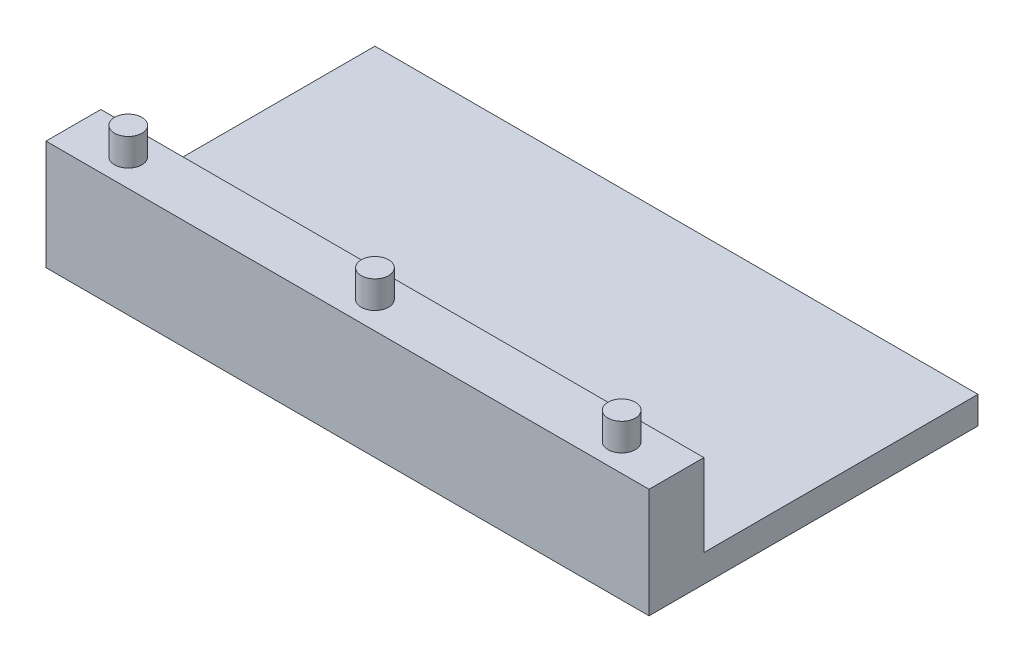
ISO-10303-21;
HEADER;
FILE_DESCRIPTION(('STEP AP214'),'2;1');
FILE_NAME('part.step','',(''),(''),'','','');
FILE_SCHEMA(('AUTOMOTIVE_DESIGN { 1 0 10303 214 1 1 1 1 }'));
ENDSEC;
DATA;
#1=APPLICATION_CONTEXT('core data for automotive mechanical design processes');
#2=APPLICATION_PROTOCOL_DEFINITION('international standard','automotive_design',2000,#1);
#3=PRODUCT_CONTEXT('',#1,'mechanical');
#4=PRODUCT('Part','Part','',(#3));
#5=PRODUCT_RELATED_PRODUCT_CATEGORY('part','',(#4));
#6=PRODUCT_DEFINITION_FORMATION('','',#4);
#7=PRODUCT_DEFINITION_CONTEXT('part definition',#1,'design');
#8=PRODUCT_DEFINITION('design','',#6,#7);
#9=PRODUCT_DEFINITION_SHAPE('','',#8);
#10=(LENGTH_UNIT() NAMED_UNIT(*) SI_UNIT(.MILLI.,.METRE.));
#11=(NAMED_UNIT(*) PLANE_ANGLE_UNIT() SI_UNIT($,.RADIAN.));
#12=(NAMED_UNIT(*) SI_UNIT($,.STERADIAN.) SOLID_ANGLE_UNIT());
#13=UNCERTAINTY_MEASURE_WITH_UNIT(LENGTH_MEASURE(1.E-05),#10,'distance_accuracy_value','');
#14=(GEOMETRIC_REPRESENTATION_CONTEXT(3) GLOBAL_UNCERTAINTY_ASSIGNED_CONTEXT((#13)) GLOBAL_UNIT_ASSIGNED_CONTEXT((#10,
#11,#12)) REPRESENTATION_CONTEXT('',''));
#15=CARTESIAN_POINT('',(0.,0.,0.));
#16=DIRECTION('',(0.,0.,1.));
#17=DIRECTION('',(1.,0.,0.));
#18=AXIS2_PLACEMENT_3D('',#15,#16,#17);
#19=CARTESIAN_POINT('',(-53.34,0.,21.59));
#20=DIRECTION('',(0.,1.,0.));
#21=DIRECTION('',(0.,0.,1.));
#22=AXIS2_PLACEMENT_3D('',#19,#20,#21);
#23=CYLINDRICAL_SURFACE('',#22,2.032);
#24=CARTESIAN_POINT('',(-53.34,6.35,21.59));
#25=DIRECTION('',(0.,1.,0.));
#26=DIRECTION('',(0.,0.,1.));
#27=AXIS2_PLACEMENT_3D('',#24,#25,#26);
#28=CIRCLE('',#27,2.032);
#29=CARTESIAN_POINT('',(-53.34,6.35,23.622));
#30=VERTEX_POINT('',#29);
#31=EDGE_CURVE('E182',#30,#30,#28,.T.);
#32=ORIENTED_EDGE('',*,*,#31,.T.);
#33=EDGE_LOOP('',(#32));
#34=FACE_BOUND('',#33,.T.);
#35=CARTESIAN_POINT('',(-53.34,3.048,21.59));
#36=DIRECTION('',(0.,-1.,0.));
#37=DIRECTION('',(0.,0.,-1.));
#38=AXIS2_PLACEMENT_3D('',#35,#36,#37);
#39=CIRCLE('',#38,2.032);
#40=CARTESIAN_POINT('',(-53.34,3.048,19.558));
#41=VERTEX_POINT('',#40);
#42=EDGE_CURVE('E37',#41,#41,#39,.F.);
#43=ORIENTED_EDGE('',*,*,#42,.F.);
#44=EDGE_LOOP('',(#43));
#45=FACE_BOUND('',#44,.T.);
#46=ADVANCED_FACE('F33',(#34,#45),#23,.F.);
#47=CARTESIAN_POINT('',(0.,6.35,0.));
#48=DIRECTION('',(0.,-1.,0.));
#49=DIRECTION('',(0.,0.,-1.));
#50=AXIS2_PLACEMENT_3D('',#47,#48,#49);
#51=PLANE('',#50);
#52=ORIENTED_EDGE('',*,*,#31,.F.);
#53=EDGE_LOOP('',(#52));
#54=FACE_BOUND('',#53,.T.);
#55=DIRECTION('',(-1.,0.,0.));
#56=VECTOR('',#55,1.);
#57=CARTESIAN_POINT('',(69.85,6.35,25.4));
#58=LINE('',#57,#56);
#59=CARTESIAN_POINT('',(69.85,6.35,25.4));
#60=VERTEX_POINT('',#59);
#61=CARTESIAN_POINT('',(-69.85,6.35,25.4));
#62=VERTEX_POINT('',#61);
#63=EDGE_CURVE('E57',#60,#62,#58,.T.);
#64=ORIENTED_EDGE('',*,*,#63,.F.);
#65=DIRECTION('',(0.,0.,-1.));
#66=VECTOR('',#65,1.);
#67=CARTESIAN_POINT('',(69.85,6.35,38.1));
#68=LINE('',#67,#66);
#69=CARTESIAN_POINT('',(69.85,6.35,-38.1));
#70=VERTEX_POINT('',#69);
#71=EDGE_CURVE('E205',#60,#70,#68,.T.);
#72=ORIENTED_EDGE('',*,*,#71,.T.);
#73=DIRECTION('',(-1.,0.,0.));
#74=VECTOR('',#73,1.);
#75=CARTESIAN_POINT('',(-69.85,6.35,-38.1));
#76=LINE('',#75,#74);
#77=CARTESIAN_POINT('',(-69.85,6.35,-38.1));
#78=VERTEX_POINT('',#77);
#79=EDGE_CURVE('E208',#70,#78,#76,.T.);
#80=ORIENTED_EDGE('',*,*,#79,.T.);
#81=DIRECTION('',(0.,0.,1.));
#82=VECTOR('',#81,1.);
#83=CARTESIAN_POINT('',(-69.85,6.35,38.1));
#84=LINE('',#83,#82);
#85=EDGE_CURVE('E203',#78,#62,#84,.T.);
#86=ORIENTED_EDGE('',*,*,#85,.T.);
#87=EDGE_LOOP('',(#64,#72,#80,#86));
#88=FACE_BOUND('',#87,.T.);
#89=ADVANCED_FACE('F244',(#54,#88),#51,.F.);
#90=CARTESIAN_POINT('',(-69.85,6.35,38.1));
#91=DIRECTION('',(1.,0.,0.));
#92=DIRECTION('',(0.,0.,-1.));
#93=AXIS2_PLACEMENT_3D('',#90,#91,#92);
#94=PLANE('',#93);
#95=DIRECTION('',(0.,0.,1.));
#96=VECTOR('',#95,1.);
#97=CARTESIAN_POINT('',(-69.85,0.,38.1));
#98=LINE('',#97,#96);
#99=CARTESIAN_POINT('',(-69.85,0.,-38.1));
#100=VERTEX_POINT('',#99);
#101=CARTESIAN_POINT('',(-69.85,0.,38.1));
#102=VERTEX_POINT('',#101);
#103=EDGE_CURVE('E202',#100,#102,#98,.T.);
#104=ORIENTED_EDGE('',*,*,#103,.T.);
#105=DIRECTION('',(0.,-1.,0.));
#106=VECTOR('',#105,1.);
#107=CARTESIAN_POINT('',(-69.85,6.35,38.1));
#108=LINE('',#107,#106);
#109=CARTESIAN_POINT('',(-69.85,25.4,38.1));
#110=VERTEX_POINT('',#109);
#111=EDGE_CURVE('E11',#110,#102,#108,.T.);
#112=ORIENTED_EDGE('',*,*,#111,.F.);
#113=DIRECTION('',(0.,0.,1.));
#114=VECTOR('',#113,1.);
#115=CARTESIAN_POINT('',(-69.85,25.4,25.4));
#116=LINE('',#115,#114);
#117=CARTESIAN_POINT('',(-69.85,25.4,25.4));
#118=VERTEX_POINT('',#117);
#119=EDGE_CURVE('E185',#118,#110,#116,.T.);
#120=ORIENTED_EDGE('',*,*,#119,.F.);
#121=DIRECTION('',(0.,-1.,0.));
#122=VECTOR('',#121,1.);
#123=CARTESIAN_POINT('',(-69.85,25.4,25.4));
#124=LINE('',#123,#122);
#125=EDGE_CURVE('E195',#118,#62,#124,.T.);
#126=ORIENTED_EDGE('',*,*,#125,.T.);
#127=ORIENTED_EDGE('',*,*,#85,.F.);
#128=DIRECTION('',(0.,-1.,0.));
#129=VECTOR('',#128,1.);
#130=CARTESIAN_POINT('',(-69.85,6.35,-38.1));
#131=LINE('',#130,#129);
#132=EDGE_CURVE('E210',#78,#100,#131,.T.);
#133=ORIENTED_EDGE('',*,*,#132,.T.);
#134=EDGE_LOOP('',(#104,#112,#120,#126,#127,#133));
#135=FACE_BOUND('',#134,.T.);
#136=ADVANCED_FACE('F35',(#135),#94,.F.);
#137=CARTESIAN_POINT('',(-69.85,6.35,38.1));
#138=DIRECTION('',(0.,0.,-1.));
#139=DIRECTION('',(-1.,0.,0.));
#140=AXIS2_PLACEMENT_3D('',#137,#138,#139);
#141=PLANE('',#140);
#142=DIRECTION('',(1.,0.,0.));
#143=VECTOR('',#142,1.);
#144=CARTESIAN_POINT('',(-69.85,0.,38.1));
#145=LINE('',#144,#143);
#146=CARTESIAN_POINT('',(69.85,0.,38.1));
#147=VERTEX_POINT('',#146);
#148=EDGE_CURVE('E213',#102,#147,#145,.T.);
#149=ORIENTED_EDGE('',*,*,#148,.T.);
#150=DIRECTION('',(0.,-1.,0.));
#151=VECTOR('',#150,1.);
#152=CARTESIAN_POINT('',(69.85,6.35,38.1));
#153=LINE('',#152,#151);
#154=CARTESIAN_POINT('',(69.85,25.4,38.1));
#155=VERTEX_POINT('',#154);
#156=EDGE_CURVE('E42',#155,#147,#153,.T.);
#157=ORIENTED_EDGE('',*,*,#156,.F.);
#158=DIRECTION('',(1.,0.,0.));
#159=VECTOR('',#158,1.);
#160=CARTESIAN_POINT('',(-69.85,25.4,38.1));
#161=LINE('',#160,#159);
#162=EDGE_CURVE('E188',#110,#155,#161,.T.);
#163=ORIENTED_EDGE('',*,*,#162,.F.);
#164=ORIENTED_EDGE('',*,*,#111,.T.);
#165=EDGE_LOOP('',(#149,#157,#163,#164));
#166=FACE_BOUND('',#165,.T.);
#167=ADVANCED_FACE('F250',(#166),#141,.F.);
#168=CARTESIAN_POINT('',(69.85,6.35,38.1));
#169=DIRECTION('',(-1.,0.,0.));
#170=DIRECTION('',(0.,0.,1.));
#171=AXIS2_PLACEMENT_3D('',#168,#169,#170);
#172=PLANE('',#171);
#173=DIRECTION('',(0.,0.,-1.));
#174=VECTOR('',#173,1.);
#175=CARTESIAN_POINT('',(69.85,0.,38.1));
#176=LINE('',#175,#174);
#177=CARTESIAN_POINT('',(69.85,0.,-38.1));
#178=VERTEX_POINT('',#177);
#179=EDGE_CURVE('E215',#147,#178,#176,.T.);
#180=ORIENTED_EDGE('',*,*,#179,.T.);
#181=DIRECTION('',(0.,-1.,0.));
#182=VECTOR('',#181,1.);
#183=CARTESIAN_POINT('',(69.85,6.35,-38.1));
#184=LINE('',#183,#182);
#185=EDGE_CURVE('E220',#70,#178,#184,.T.);
#186=ORIENTED_EDGE('',*,*,#185,.F.);
#187=ORIENTED_EDGE('',*,*,#71,.F.);
#188=DIRECTION('',(0.,-1.,0.));
#189=VECTOR('',#188,1.);
#190=CARTESIAN_POINT('',(69.85,25.4,25.4));
#191=LINE('',#190,#189);
#192=CARTESIAN_POINT('',(69.85,25.4,25.4));
#193=VERTEX_POINT('',#192);
#194=EDGE_CURVE('E199',#193,#60,#191,.T.);
#195=ORIENTED_EDGE('',*,*,#194,.F.);
#196=DIRECTION('',(0.,0.,-1.));
#197=VECTOR('',#196,1.);
#198=CARTESIAN_POINT('',(69.85,25.4,38.1));
#199=LINE('',#198,#197);
#200=EDGE_CURVE('E191',#155,#193,#199,.T.);
#201=ORIENTED_EDGE('',*,*,#200,.F.);
#202=ORIENTED_EDGE('',*,*,#156,.T.);
#203=EDGE_LOOP('',(#180,#186,#187,#195,#201,#202));
#204=FACE_BOUND('',#203,.T.);
#205=ADVANCED_FACE('F227',(#204),#172,.F.);
#206=CARTESIAN_POINT('',(-69.85,6.35,-38.1));
#207=DIRECTION('',(0.,0.,1.));
#208=DIRECTION('',(1.,0.,0.));
#209=AXIS2_PLACEMENT_3D('',#206,#207,#208);
#210=PLANE('',#209);
#211=DIRECTION('',(-1.,0.,0.));
#212=VECTOR('',#211,1.);
#213=CARTESIAN_POINT('',(-69.85,0.,-38.1));
#214=LINE('',#213,#212);
#215=EDGE_CURVE('E206',#178,#100,#214,.T.);
#216=ORIENTED_EDGE('',*,*,#215,.T.);
#217=ORIENTED_EDGE('',*,*,#132,.F.);
#218=ORIENTED_EDGE('',*,*,#79,.F.);
#219=ORIENTED_EDGE('',*,*,#185,.T.);
#220=EDGE_LOOP('',(#216,#217,#218,#219));
#221=FACE_BOUND('',#220,.T.);
#222=ADVANCED_FACE('F238',(#221),#210,.F.);
#223=CARTESIAN_POINT('',(0.,0.,0.));
#224=DIRECTION('',(0.,-1.,0.));
#225=DIRECTION('',(0.,0.,-1.));
#226=AXIS2_PLACEMENT_3D('',#223,#224,#225);
#227=PLANE('',#226);
#228=DIRECTION('',(-0.499999999999999,0.,0.866025403784439));
#229=VECTOR('',#228,1.);
#230=CARTESIAN_POINT('',(-48.514,0.,21.59));
#231=LINE('',#230,#229);
#232=CARTESIAN_POINT('',(-48.514,0.,21.59));
#233=VERTEX_POINT('',#232);
#234=CARTESIAN_POINT('',(-50.927,0.,25.7694385986637));
#235=VERTEX_POINT('',#234);
#236=EDGE_CURVE('E49',#233,#235,#231,.T.);
#237=ORIENTED_EDGE('',*,*,#236,.F.);
#238=DIRECTION('',(0.5,0.,0.866025403784439));
#239=VECTOR('',#238,1.);
#240=CARTESIAN_POINT('',(-50.927,0.,17.4105614013363));
#241=LINE('',#240,#239);
#242=CARTESIAN_POINT('',(-50.927,0.,17.4105614013363));
#243=VERTEX_POINT('',#242);
#244=EDGE_CURVE('E145',#243,#233,#241,.T.);
#245=ORIENTED_EDGE('',*,*,#244,.F.);
#246=DIRECTION('',(1.,0.,0.));
#247=VECTOR('',#246,1.);
#248=CARTESIAN_POINT('',(-55.753,0.,17.4105614013363));
#249=LINE('',#248,#247);
#250=CARTESIAN_POINT('',(-55.753,0.,17.4105614013363));
#251=VERTEX_POINT('',#250);
#252=EDGE_CURVE('E148',#251,#243,#249,.T.);
#253=ORIENTED_EDGE('',*,*,#252,.F.);
#254=DIRECTION('',(0.5,0.,-0.866025403784439));
#255=VECTOR('',#254,1.);
#256=CARTESIAN_POINT('',(-58.166,0.,21.59));
#257=LINE('',#256,#255);
#258=CARTESIAN_POINT('',(-58.166,0.,21.59));
#259=VERTEX_POINT('',#258);
#260=EDGE_CURVE('E168',#259,#251,#257,.T.);
#261=ORIENTED_EDGE('',*,*,#260,.F.);
#262=DIRECTION('',(-0.499999999999999,0.,-0.866025403784439));
#263=VECTOR('',#262,1.);
#264=CARTESIAN_POINT('',(-55.753,0.,25.7694385986637));
#265=LINE('',#264,#263);
#266=CARTESIAN_POINT('',(-55.753,0.,25.7694385986637));
#267=VERTEX_POINT('',#266);
#268=EDGE_CURVE('E165',#267,#259,#265,.T.);
#269=ORIENTED_EDGE('',*,*,#268,.F.);
#270=DIRECTION('',(-1.,0.,0.));
#271=VECTOR('',#270,1.);
#272=CARTESIAN_POINT('',(-50.927,0.,25.7694385986637));
#273=LINE('',#272,#271);
#274=EDGE_CURVE('E162',#235,#267,#273,.T.);
#275=ORIENTED_EDGE('',*,*,#274,.F.);
#276=EDGE_LOOP('',(#237,#245,#253,#261,#269,#275));
#277=FACE_BOUND('',#276,.T.);
#278=ORIENTED_EDGE('',*,*,#103,.F.);
#279=ORIENTED_EDGE('',*,*,#215,.F.);
#280=ORIENTED_EDGE('',*,*,#179,.F.);
#281=ORIENTED_EDGE('',*,*,#148,.F.);
#282=EDGE_LOOP('',(#278,#279,#280,#281));
#283=FACE_BOUND('',#282,.T.);
#284=ADVANCED_FACE('F235',(#277,#283),#227,.T.);
#285=CARTESIAN_POINT('',(69.85,25.4,25.4));
#286=DIRECTION('',(0.,0.,1.));
#287=DIRECTION('',(1.,0.,0.));
#288=AXIS2_PLACEMENT_3D('',#285,#286,#287);
#289=PLANE('',#288);
#290=ORIENTED_EDGE('',*,*,#63,.T.);
#291=ORIENTED_EDGE('',*,*,#125,.F.);
#292=DIRECTION('',(-1.,0.,0.));
#293=VECTOR('',#292,1.);
#294=CARTESIAN_POINT('',(69.85,25.4,25.4));
#295=LINE('',#294,#293);
#296=EDGE_CURVE('E193',#193,#118,#295,.T.);
#297=ORIENTED_EDGE('',*,*,#296,.F.);
#298=ORIENTED_EDGE('',*,*,#194,.T.);
#299=EDGE_LOOP('',(#290,#291,#297,#298));
#300=FACE_BOUND('',#299,.T.);
#301=ADVANCED_FACE('F246',(#300),#289,.F.);
#302=CARTESIAN_POINT('',(0.,25.4,0.));
#303=DIRECTION('',(0.,1.,0.));
#304=DIRECTION('',(0.,0.,1.));
#305=AXIS2_PLACEMENT_3D('',#302,#303,#304);
#306=PLANE('',#305);
#307=CARTESIAN_POINT('',(57.1499999999998,25.4,31.75));
#308=DIRECTION('',(0.,1.,0.));
#309=DIRECTION('',(0.,0.,1.));
#310=AXIS2_PLACEMENT_3D('',#307,#308,#309);
#311=CIRCLE('',#310,3.175);
#312=CARTESIAN_POINT('',(57.1499999999998,25.4,34.925));
#313=VERTEX_POINT('',#312);
#314=EDGE_CURVE('E463',#313,#313,#311,.T.);
#315=ORIENTED_EDGE('',*,*,#314,.F.);
#316=EDGE_LOOP('',(#315));
#317=FACE_BOUND('',#316,.T.);
#318=CARTESIAN_POINT('',(0.,25.4,31.75));
#319=DIRECTION('',(0.,1.,0.));
#320=DIRECTION('',(0.,0.,1.));
#321=AXIS2_PLACEMENT_3D('',#318,#319,#320);
#322=CIRCLE('',#321,3.175);
#323=CARTESIAN_POINT('',(0.,25.4,34.925));
#324=VERTEX_POINT('',#323);
#325=EDGE_CURVE('E462',#324,#324,#322,.T.);
#326=ORIENTED_EDGE('',*,*,#325,.F.);
#327=EDGE_LOOP('',(#326));
#328=FACE_BOUND('',#327,.T.);
#329=CARTESIAN_POINT('',(-57.15,25.4,31.75));
#330=DIRECTION('',(0.,1.,0.));
#331=DIRECTION('',(0.,0.,1.));
#332=AXIS2_PLACEMENT_3D('',#329,#330,#331);
#333=CIRCLE('',#332,3.175);
#334=CARTESIAN_POINT('',(-57.15,25.4,34.925));
#335=VERTEX_POINT('',#334);
#336=EDGE_CURVE('E151',#335,#335,#333,.T.);
#337=ORIENTED_EDGE('',*,*,#336,.F.);
#338=EDGE_LOOP('',(#337));
#339=FACE_BOUND('',#338,.T.);
#340=ORIENTED_EDGE('',*,*,#119,.T.);
#341=ORIENTED_EDGE('',*,*,#162,.T.);
#342=ORIENTED_EDGE('',*,*,#200,.T.);
#343=ORIENTED_EDGE('',*,*,#296,.T.);
#344=EDGE_LOOP('',(#340,#341,#342,#343));
#345=FACE_BOUND('',#344,.T.);
#346=ADVANCED_FACE('F249',(#317,#328,#339,#345),#306,.T.);
#347=CARTESIAN_POINT('',(0.,3.048,0.));
#348=DIRECTION('',(0.,-1.,0.));
#349=DIRECTION('',(0.,0.,-1.));
#350=AXIS2_PLACEMENT_3D('',#347,#348,#349);
#351=PLANE('',#350);
#352=DIRECTION('',(-0.499999999999999,0.,0.866025403784439));
#353=VECTOR('',#352,1.);
#354=CARTESIAN_POINT('',(-48.514,3.048,21.59));
#355=LINE('',#354,#353);
#356=CARTESIAN_POINT('',(-48.514,3.048,21.59));
#357=VERTEX_POINT('',#356);
#358=CARTESIAN_POINT('',(-50.927,3.048,25.7694385986637));
#359=VERTEX_POINT('',#358);
#360=EDGE_CURVE('E125',#357,#359,#355,.T.);
#361=ORIENTED_EDGE('',*,*,#360,.T.);
#362=DIRECTION('',(-1.,0.,0.));
#363=VECTOR('',#362,1.);
#364=CARTESIAN_POINT('',(-50.927,3.048,25.7694385986637));
#365=LINE('',#364,#363);
#366=CARTESIAN_POINT('',(-55.753,3.048,25.7694385986637));
#367=VERTEX_POINT('',#366);
#368=EDGE_CURVE('E134',#359,#367,#365,.T.);
#369=ORIENTED_EDGE('',*,*,#368,.T.);
#370=DIRECTION('',(-0.499999999999999,0.,-0.866025403784439));
#371=VECTOR('',#370,1.);
#372=CARTESIAN_POINT('',(-55.753,3.048,25.7694385986637));
#373=LINE('',#372,#371);
#374=CARTESIAN_POINT('',(-58.166,3.048,21.59));
#375=VERTEX_POINT('',#374);
#376=EDGE_CURVE('E139',#367,#375,#373,.T.);
#377=ORIENTED_EDGE('',*,*,#376,.T.);
#378=DIRECTION('',(0.5,0.,-0.866025403784439));
#379=VECTOR('',#378,1.);
#380=CARTESIAN_POINT('',(-58.166,3.048,21.59));
#381=LINE('',#380,#379);
#382=CARTESIAN_POINT('',(-55.753,3.048,17.4105614013363));
#383=VERTEX_POINT('',#382);
#384=EDGE_CURVE('E155',#375,#383,#381,.T.);
#385=ORIENTED_EDGE('',*,*,#384,.T.);
#386=DIRECTION('',(1.,0.,0.));
#387=VECTOR('',#386,1.);
#388=CARTESIAN_POINT('',(-55.753,3.048,17.4105614013363));
#389=LINE('',#388,#387);
#390=CARTESIAN_POINT('',(-50.927,3.048,17.4105614013363));
#391=VERTEX_POINT('',#390);
#392=EDGE_CURVE('E158',#383,#391,#389,.T.);
#393=ORIENTED_EDGE('',*,*,#392,.T.);
#394=DIRECTION('',(0.5,0.,0.866025403784439));
#395=VECTOR('',#394,1.);
#396=CARTESIAN_POINT('',(-50.927,3.048,17.4105614013363));
#397=LINE('',#396,#395);
#398=EDGE_CURVE('E131',#391,#357,#397,.T.);
#399=ORIENTED_EDGE('',*,*,#398,.T.);
#400=EDGE_LOOP('',(#361,#369,#377,#385,#393,#399));
#401=FACE_BOUND('',#400,.T.);
#402=ORIENTED_EDGE('',*,*,#42,.T.);
#403=EDGE_LOOP('',(#402));
#404=FACE_BOUND('',#403,.T.);
#405=ADVANCED_FACE('F141',(#401,#404),#351,.T.);
#406=CARTESIAN_POINT('',(-48.514,3.048,21.59));
#407=DIRECTION('',(0.866025403784439,0.,0.499999999999999));
#408=DIRECTION('',(0.5,0.,-0.866025403784439));
#409=AXIS2_PLACEMENT_3D('',#406,#407,#408);
#410=PLANE('',#409);
#411=ORIENTED_EDGE('',*,*,#236,.T.);
#412=DIRECTION('',(0.,-1.,0.));
#413=VECTOR('',#412,1.);
#414=CARTESIAN_POINT('',(-50.927,3.048,25.7694385986637));
#415=LINE('',#414,#413);
#416=EDGE_CURVE('E121',#359,#235,#415,.T.);
#417=ORIENTED_EDGE('',*,*,#416,.F.);
#418=ORIENTED_EDGE('',*,*,#360,.F.);
#419=DIRECTION('',(0.,-1.,0.));
#420=VECTOR('',#419,1.);
#421=CARTESIAN_POINT('',(-48.514,3.048,21.59));
#422=LINE('',#421,#420);
#423=EDGE_CURVE('E173',#357,#233,#422,.T.);
#424=ORIENTED_EDGE('',*,*,#423,.T.);
#425=EDGE_LOOP('',(#411,#417,#418,#424));
#426=FACE_BOUND('',#425,.T.);
#427=ADVANCED_FACE('F123',(#426),#410,.F.);
#428=CARTESIAN_POINT('',(-50.927,3.048,17.4105614013363));
#429=DIRECTION('',(0.866025403784439,0.,-0.5));
#430=DIRECTION('',(-0.5,0.,-0.866025403784439));
#431=AXIS2_PLACEMENT_3D('',#428,#429,#430);
#432=PLANE('',#431);
#433=ORIENTED_EDGE('',*,*,#244,.T.);
#434=ORIENTED_EDGE('',*,*,#423,.F.);
#435=ORIENTED_EDGE('',*,*,#398,.F.);
#436=DIRECTION('',(0.,-1.,0.));
#437=VECTOR('',#436,1.);
#438=CARTESIAN_POINT('',(-50.927,3.048,17.4105614013363));
#439=LINE('',#438,#437);
#440=EDGE_CURVE('E175',#391,#243,#439,.T.);
#441=ORIENTED_EDGE('',*,*,#440,.T.);
#442=EDGE_LOOP('',(#433,#434,#435,#441));
#443=FACE_BOUND('',#442,.T.);
#444=ADVANCED_FACE('F310',(#443),#432,.F.);
#445=CARTESIAN_POINT('',(-55.753,3.048,17.4105614013363));
#446=DIRECTION('',(0.,0.,-1.));
#447=DIRECTION('',(-1.,0.,0.));
#448=AXIS2_PLACEMENT_3D('',#445,#446,#447);
#449=PLANE('',#448);
#450=ORIENTED_EDGE('',*,*,#252,.T.);
#451=ORIENTED_EDGE('',*,*,#440,.F.);
#452=ORIENTED_EDGE('',*,*,#392,.F.);
#453=DIRECTION('',(0.,-1.,0.));
#454=VECTOR('',#453,1.);
#455=CARTESIAN_POINT('',(-55.753,3.048,17.4105614013363));
#456=LINE('',#455,#454);
#457=EDGE_CURVE('E177',#383,#251,#456,.T.);
#458=ORIENTED_EDGE('',*,*,#457,.T.);
#459=EDGE_LOOP('',(#450,#451,#452,#458));
#460=FACE_BOUND('',#459,.T.);
#461=ADVANCED_FACE('F316',(#460),#449,.F.);
#462=CARTESIAN_POINT('',(-58.166,3.048,21.59));
#463=DIRECTION('',(-0.866025403784439,0.,-0.5));
#464=DIRECTION('',(-0.5,0.,0.866025403784439));
#465=AXIS2_PLACEMENT_3D('',#462,#463,#464);
#466=PLANE('',#465);
#467=ORIENTED_EDGE('',*,*,#260,.T.);
#468=ORIENTED_EDGE('',*,*,#457,.F.);
#469=ORIENTED_EDGE('',*,*,#384,.F.);
#470=DIRECTION('',(0.,-1.,0.));
#471=VECTOR('',#470,1.);
#472=CARTESIAN_POINT('',(-58.166,3.048,21.59));
#473=LINE('',#472,#471);
#474=EDGE_CURVE('E179',#375,#259,#473,.T.);
#475=ORIENTED_EDGE('',*,*,#474,.T.);
#476=EDGE_LOOP('',(#467,#468,#469,#475));
#477=FACE_BOUND('',#476,.T.);
#478=ADVANCED_FACE('F324',(#477),#466,.F.);
#479=CARTESIAN_POINT('',(-55.753,3.048,25.7694385986637));
#480=DIRECTION('',(-0.866025403784439,0.,0.499999999999999));
#481=DIRECTION('',(0.5,0.,0.866025403784439));
#482=AXIS2_PLACEMENT_3D('',#479,#480,#481);
#483=PLANE('',#482);
#484=ORIENTED_EDGE('',*,*,#268,.T.);
#485=ORIENTED_EDGE('',*,*,#474,.F.);
#486=ORIENTED_EDGE('',*,*,#376,.F.);
#487=DIRECTION('',(0.,-1.,0.));
#488=VECTOR('',#487,1.);
#489=CARTESIAN_POINT('',(-55.753,3.048,25.7694385986637));
#490=LINE('',#489,#488);
#491=EDGE_CURVE('E130',#367,#267,#490,.T.);
#492=ORIENTED_EDGE('',*,*,#491,.T.);
#493=EDGE_LOOP('',(#484,#485,#486,#492));
#494=FACE_BOUND('',#493,.T.);
#495=ADVANCED_FACE('F332',(#494),#483,.F.);
#496=CARTESIAN_POINT('',(-50.927,3.048,25.7694385986637));
#497=DIRECTION('',(0.,0.,1.));
#498=DIRECTION('',(1.,0.,0.));
#499=AXIS2_PLACEMENT_3D('',#496,#497,#498);
#500=PLANE('',#499);
#501=ORIENTED_EDGE('',*,*,#274,.T.);
#502=ORIENTED_EDGE('',*,*,#491,.F.);
#503=ORIENTED_EDGE('',*,*,#368,.F.);
#504=ORIENTED_EDGE('',*,*,#416,.T.);
#505=EDGE_LOOP('',(#501,#502,#503,#504));
#506=FACE_BOUND('',#505,.T.);
#507=ADVANCED_FACE('F135',(#506),#500,.F.);
#508=CARTESIAN_POINT('',(-57.15,31.75,31.75));
#509=DIRECTION('',(0.,-1.,0.));
#510=DIRECTION('',(0.,0.,-1.));
#511=AXIS2_PLACEMENT_3D('',#508,#509,#510);
#512=CYLINDRICAL_SURFACE('',#511,3.175);
#513=CARTESIAN_POINT('',(-57.15,31.75,31.75));
#514=DIRECTION('',(0.,1.,0.));
#515=DIRECTION('',(0.,0.,1.));
#516=AXIS2_PLACEMENT_3D('',#513,#514,#515);
#517=CIRCLE('',#516,3.175);
#518=CARTESIAN_POINT('',(-57.15,31.75,34.925));
#519=VERTEX_POINT('',#518);
#520=EDGE_CURVE('E163',#519,#519,#517,.T.);
#521=ORIENTED_EDGE('',*,*,#520,.F.);
#522=EDGE_LOOP('',(#521));
#523=FACE_BOUND('',#522,.T.);
#524=ORIENTED_EDGE('',*,*,#336,.T.);
#525=EDGE_LOOP('',(#524));
#526=FACE_BOUND('',#525,.T.);
#527=ADVANCED_FACE('F346',(#523,#526),#512,.T.);
#528=CARTESIAN_POINT('',(-57.15,31.75,31.75));
#529=DIRECTION('',(0.,1.,0.));
#530=DIRECTION('',(0.,0.,1.));
#531=AXIS2_PLACEMENT_3D('',#528,#529,#530);
#532=PLANE('',#531);
#533=ORIENTED_EDGE('',*,*,#520,.T.);
#534=EDGE_LOOP('',(#533));
#535=FACE_BOUND('',#534,.T.);
#536=ADVANCED_FACE('F351',(#535),#532,.T.);
#537=CARTESIAN_POINT('',(0.,31.75,31.75));
#538=DIRECTION('',(0.,-1.,0.));
#539=DIRECTION('',(0.,0.,-1.));
#540=AXIS2_PLACEMENT_3D('',#537,#538,#539);
#541=CYLINDRICAL_SURFACE('',#540,3.175);
#542=CARTESIAN_POINT('',(0.,31.75,31.75));
#543=DIRECTION('',(0.,1.,0.));
#544=DIRECTION('',(0.,0.,1.));
#545=AXIS2_PLACEMENT_3D('',#542,#543,#544);
#546=CIRCLE('',#545,3.175);
#547=CARTESIAN_POINT('',(0.,31.75,34.925));
#548=VERTEX_POINT('',#547);
#549=EDGE_CURVE('E466',#548,#548,#546,.T.);
#550=ORIENTED_EDGE('',*,*,#549,.F.);
#551=EDGE_LOOP('',(#550));
#552=FACE_BOUND('',#551,.T.);
#553=ORIENTED_EDGE('',*,*,#325,.T.);
#554=EDGE_LOOP('',(#553));
#555=FACE_BOUND('',#554,.T.);
#556=ADVANCED_FACE('F359',(#552,#555),#541,.T.);
#557=CARTESIAN_POINT('',(0.,31.75,31.75));
#558=DIRECTION('',(0.,1.,0.));
#559=DIRECTION('',(0.,0.,1.));
#560=AXIS2_PLACEMENT_3D('',#557,#558,#559);
#561=PLANE('',#560);
#562=ORIENTED_EDGE('',*,*,#549,.T.);
#563=EDGE_LOOP('',(#562));
#564=FACE_BOUND('',#563,.T.);
#565=ADVANCED_FACE('F367',(#564),#561,.T.);
#566=CARTESIAN_POINT('',(57.1499999999998,31.75,31.75));
#567=DIRECTION('',(0.,-1.,0.));
#568=DIRECTION('',(0.,0.,-1.));
#569=AXIS2_PLACEMENT_3D('',#566,#567,#568);
#570=CYLINDRICAL_SURFACE('',#569,3.175);
#571=CARTESIAN_POINT('',(57.1499999999998,31.75,31.75));
#572=DIRECTION('',(0.,1.,0.));
#573=DIRECTION('',(0.,0.,1.));
#574=AXIS2_PLACEMENT_3D('',#571,#572,#573);
#575=CIRCLE('',#574,3.175);
#576=CARTESIAN_POINT('',(57.1499999999998,31.75,34.925));
#577=VERTEX_POINT('',#576);
#578=EDGE_CURVE('E461',#577,#577,#575,.T.);
#579=ORIENTED_EDGE('',*,*,#578,.F.);
#580=EDGE_LOOP('',(#579));
#581=FACE_BOUND('',#580,.T.);
#582=ORIENTED_EDGE('',*,*,#314,.T.);
#583=EDGE_LOOP('',(#582));
#584=FACE_BOUND('',#583,.T.);
#585=ADVANCED_FACE('F375',(#581,#584),#570,.T.);
#586=CARTESIAN_POINT('',(57.1499999999998,31.75,31.75));
#587=DIRECTION('',(0.,1.,0.));
#588=DIRECTION('',(0.,0.,1.));
#589=AXIS2_PLACEMENT_3D('',#586,#587,#588);
#590=PLANE('',#589);
#591=ORIENTED_EDGE('',*,*,#578,.T.);
#592=EDGE_LOOP('',(#591));
#593=FACE_BOUND('',#592,.T.);
#594=ADVANCED_FACE('F383',(#593),#590,.T.);
#595=CLOSED_SHELL('',(#46,#89,#136,#167,#205,#222,#284,#301,#346,#405,#427,#444,#461,#478,#495,
#507,#527,#536,#556,#565,#585,#594));
#596=MANIFOLD_SOLID_BREP('B2',#595);
#597=ADVANCED_BREP_SHAPE_REPRESENTATION('',(#18,#596),#14);
#598=SHAPE_DEFINITION_REPRESENTATION(#9,#597);
ENDSEC;
END-ISO-10303-21;
